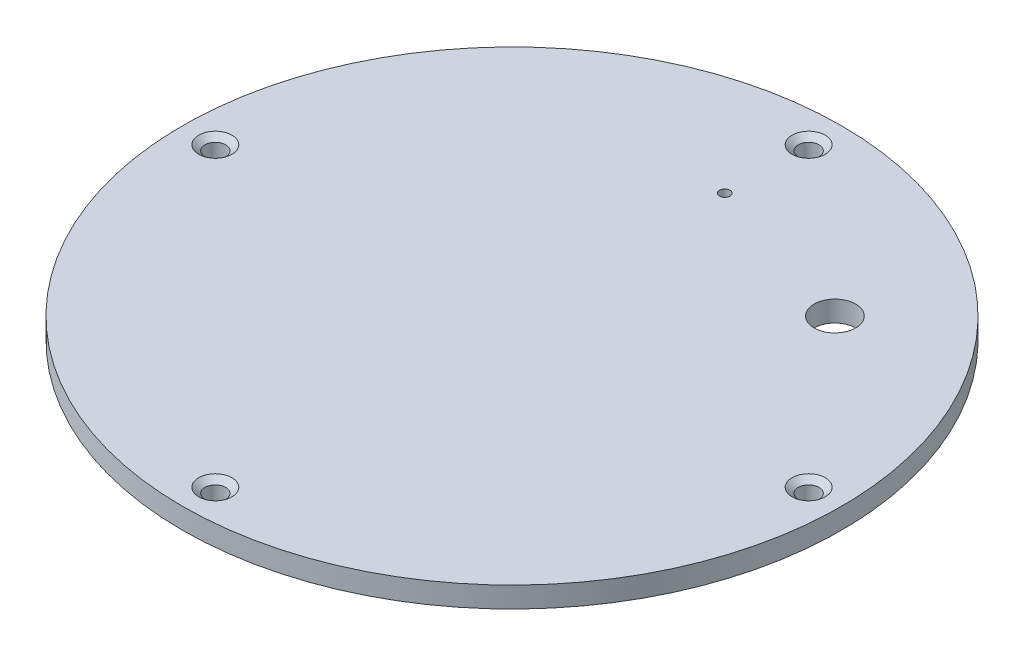
ISO-10303-21;
HEADER;
FILE_DESCRIPTION(('STEP AP214'),'2;1');
FILE_NAME('part.step','',(''),(''),'','','');
FILE_SCHEMA(('AUTOMOTIVE_DESIGN { 1 0 10303 214 1 1 1 1 }'));
ENDSEC;
DATA;
#1=APPLICATION_CONTEXT('core data for automotive mechanical design processes');
#2=APPLICATION_PROTOCOL_DEFINITION('international standard','automotive_design',2000,#1);
#3=PRODUCT_CONTEXT('',#1,'mechanical');
#4=PRODUCT('Part','Part','',(#3));
#5=PRODUCT_RELATED_PRODUCT_CATEGORY('part','',(#4));
#6=PRODUCT_DEFINITION_FORMATION('','',#4);
#7=PRODUCT_DEFINITION_CONTEXT('part definition',#1,'design');
#8=PRODUCT_DEFINITION('design','',#6,#7);
#9=PRODUCT_DEFINITION_SHAPE('','',#8);
#10=(LENGTH_UNIT() NAMED_UNIT(*) SI_UNIT(.MILLI.,.METRE.));
#11=(NAMED_UNIT(*) PLANE_ANGLE_UNIT() SI_UNIT($,.RADIAN.));
#12=(NAMED_UNIT(*) SI_UNIT($,.STERADIAN.) SOLID_ANGLE_UNIT());
#13=UNCERTAINTY_MEASURE_WITH_UNIT(LENGTH_MEASURE(1.E-05),#10,'distance_accuracy_value','');
#14=(GEOMETRIC_REPRESENTATION_CONTEXT(3) GLOBAL_UNCERTAINTY_ASSIGNED_CONTEXT((#13)) GLOBAL_UNIT_ASSIGNED_CONTEXT((#10,
#11,#12)) REPRESENTATION_CONTEXT('',''));
#15=CARTESIAN_POINT('',(0.,0.,0.));
#16=DIRECTION('',(0.,0.,1.));
#17=DIRECTION('',(1.,0.,0.));
#18=AXIS2_PLACEMENT_3D('',#15,#16,#17);
#19=CARTESIAN_POINT('',(0.,1.,0.));
#20=DIRECTION('',(0.,-1.,0.));
#21=DIRECTION('',(0.,0.,-1.));
#22=AXIS2_PLACEMENT_3D('',#19,#20,#21);
#23=CYLINDRICAL_SURFACE('',#22,15.875);
#24=CARTESIAN_POINT('',(0.,1.,0.));
#25=DIRECTION('',(0.,1.,0.));
#26=DIRECTION('',(0.,0.,1.));
#27=AXIS2_PLACEMENT_3D('',#24,#25,#26);
#28=CIRCLE('',#27,15.875);
#29=CARTESIAN_POINT('',(0.,1.,15.875));
#30=VERTEX_POINT('',#29);
#31=EDGE_CURVE('E10',#30,#30,#28,.T.);
#32=ORIENTED_EDGE('',*,*,#31,.F.);
#33=EDGE_LOOP('',(#32));
#34=FACE_BOUND('',#33,.T.);
#35=CARTESIAN_POINT('',(0.,0.,0.));
#36=DIRECTION('',(0.,1.,0.));
#37=DIRECTION('',(0.,0.,1.));
#38=AXIS2_PLACEMENT_3D('',#35,#36,#37);
#39=CIRCLE('',#38,15.875);
#40=CARTESIAN_POINT('',(0.,0.,15.875));
#41=VERTEX_POINT('',#40);
#42=EDGE_CURVE('E35',#41,#41,#39,.T.);
#43=ORIENTED_EDGE('',*,*,#42,.T.);
#44=EDGE_LOOP('',(#43));
#45=FACE_BOUND('',#44,.T.);
#46=ADVANCED_FACE('F32',(#34,#45),#23,.T.);
#47=CARTESIAN_POINT('',(0.,1.,0.));
#48=DIRECTION('',(0.,1.,0.));
#49=DIRECTION('',(0.,0.,1.));
#50=AXIS2_PLACEMENT_3D('',#47,#48,#49);
#51=PLANE('',#50);
#52=CARTESIAN_POINT('',(0.,1.,-10.25));
#53=DIRECTION('',(0.,1.,0.));
#54=DIRECTION('',(0.,0.,1.));
#55=AXIS2_PLACEMENT_3D('',#52,#53,#54);
#56=CIRCLE('',#55,0.25);
#57=CARTESIAN_POINT('',(0.,1.,-10.));
#58=VERTEX_POINT('',#57);
#59=EDGE_CURVE('E79',#58,#58,#56,.T.);
#60=ORIENTED_EDGE('',*,*,#59,.F.);
#61=EDGE_LOOP('',(#60));
#62=FACE_BOUND('',#61,.T.);
#63=CARTESIAN_POINT('',(7.77817459305201,1.,-7.77817459305204));
#64=DIRECTION('',(0.,1.,0.));
#65=DIRECTION('',(0.,0.,1.));
#66=AXIS2_PLACEMENT_3D('',#63,#64,#65);
#67=CIRCLE('',#66,1.00000000000001);
#68=CARTESIAN_POINT('',(7.77817459305201,1.,-6.77817459305202));
#69=VERTEX_POINT('',#68);
#70=EDGE_CURVE('E82',#69,#69,#67,.T.);
#71=ORIENTED_EDGE('',*,*,#70,.F.);
#72=EDGE_LOOP('',(#71));
#73=FACE_BOUND('',#72,.T.);
#74=CARTESIAN_POINT('',(0.,1.,-14.29));
#75=DIRECTION('',(0.,1.,0.));
#76=DIRECTION('',(0.,0.,1.));
#77=AXIS2_PLACEMENT_3D('',#74,#75,#76);
#78=CIRCLE('',#77,0.8);
#79=CARTESIAN_POINT('',(0.,1.,-13.49));
#80=VERTEX_POINT('',#79);
#81=EDGE_CURVE('E76',#80,#80,#78,.T.);
#82=ORIENTED_EDGE('',*,*,#81,.F.);
#83=EDGE_LOOP('',(#82));
#84=FACE_BOUND('',#83,.T.);
#85=CARTESIAN_POINT('',(14.29,1.,0.));
#86=DIRECTION('',(0.,1.,0.));
#87=DIRECTION('',(0.,0.,1.));
#88=AXIS2_PLACEMENT_3D('',#85,#86,#87);
#89=CIRCLE('',#88,0.8);
#90=CARTESIAN_POINT('',(14.29,1.,0.8));
#91=VERTEX_POINT('',#90);
#92=EDGE_CURVE('E67',#91,#91,#89,.T.);
#93=ORIENTED_EDGE('',*,*,#92,.F.);
#94=EDGE_LOOP('',(#93));
#95=FACE_BOUND('',#94,.T.);
#96=CARTESIAN_POINT('',(0.,1.,14.29));
#97=DIRECTION('',(0.,1.,0.));
#98=DIRECTION('',(0.,0.,1.));
#99=AXIS2_PLACEMENT_3D('',#96,#97,#98);
#100=CIRCLE('',#99,0.8);
#101=CARTESIAN_POINT('',(0.,1.,15.09));
#102=VERTEX_POINT('',#101);
#103=EDGE_CURVE('E58',#102,#102,#100,.T.);
#104=ORIENTED_EDGE('',*,*,#103,.F.);
#105=EDGE_LOOP('',(#104));
#106=FACE_BOUND('',#105,.T.);
#107=CARTESIAN_POINT('',(-14.29,1.,0.));
#108=DIRECTION('',(0.,1.,0.));
#109=DIRECTION('',(0.,0.,1.));
#110=AXIS2_PLACEMENT_3D('',#107,#108,#109);
#111=CIRCLE('',#110,0.8);
#112=CARTESIAN_POINT('',(-14.29,1.,0.8));
#113=VERTEX_POINT('',#112);
#114=EDGE_CURVE('E49',#113,#113,#111,.T.);
#115=ORIENTED_EDGE('',*,*,#114,.F.);
#116=EDGE_LOOP('',(#115));
#117=FACE_BOUND('',#116,.T.);
#118=ORIENTED_EDGE('',*,*,#31,.T.);
#119=EDGE_LOOP('',(#118));
#120=FACE_BOUND('',#119,.T.);
#121=ADVANCED_FACE('F107',(#62,#73,#84,#95,#106,#117,#120),#51,.T.);
#122=CARTESIAN_POINT('',(0.,0.,0.));
#123=DIRECTION('',(0.,1.,0.));
#124=DIRECTION('',(0.,0.,1.));
#125=AXIS2_PLACEMENT_3D('',#122,#123,#124);
#126=PLANE('',#125);
#127=CARTESIAN_POINT('',(0.,0.,-10.25));
#128=DIRECTION('',(0.,1.,0.));
#129=DIRECTION('',(0.,0.,1.));
#130=AXIS2_PLACEMENT_3D('',#127,#128,#129);
#131=CIRCLE('',#130,0.25);
#132=CARTESIAN_POINT('',(0.,0.,-10.));
#133=VERTEX_POINT('',#132);
#134=EDGE_CURVE('E85',#133,#133,#131,.T.);
#135=ORIENTED_EDGE('',*,*,#134,.T.);
#136=EDGE_LOOP('',(#135));
#137=FACE_BOUND('',#136,.T.);
#138=CARTESIAN_POINT('',(7.77817459305201,0.,-7.77817459305204));
#139=DIRECTION('',(0.,1.,0.));
#140=DIRECTION('',(0.,0.,1.));
#141=AXIS2_PLACEMENT_3D('',#138,#139,#140);
#142=CIRCLE('',#141,1.00000000000001);
#143=CARTESIAN_POINT('',(7.77817459305201,0.,-6.77817459305202));
#144=VERTEX_POINT('',#143);
#145=EDGE_CURVE('E86',#144,#144,#142,.T.);
#146=ORIENTED_EDGE('',*,*,#145,.T.);
#147=EDGE_LOOP('',(#146));
#148=FACE_BOUND('',#147,.T.);
#149=CARTESIAN_POINT('',(0.,0.,-14.29));
#150=DIRECTION('',(0.,1.,0.));
#151=DIRECTION('',(0.,0.,1.));
#152=AXIS2_PLACEMENT_3D('',#149,#150,#151);
#153=CIRCLE('',#152,0.499999999999988);
#154=CARTESIAN_POINT('',(0.,0.,-13.79));
#155=VERTEX_POINT('',#154);
#156=EDGE_CURVE('E70',#155,#155,#153,.T.);
#157=ORIENTED_EDGE('',*,*,#156,.T.);
#158=EDGE_LOOP('',(#157));
#159=FACE_BOUND('',#158,.T.);
#160=CARTESIAN_POINT('',(14.29,0.,0.));
#161=DIRECTION('',(0.,1.,0.));
#162=DIRECTION('',(0.,0.,1.));
#163=AXIS2_PLACEMENT_3D('',#160,#161,#162);
#164=CIRCLE('',#163,0.499999999999988);
#165=CARTESIAN_POINT('',(14.29,0.,0.499999999999988));
#166=VERTEX_POINT('',#165);
#167=EDGE_CURVE('E61',#166,#166,#164,.T.);
#168=ORIENTED_EDGE('',*,*,#167,.T.);
#169=EDGE_LOOP('',(#168));
#170=FACE_BOUND('',#169,.T.);
#171=CARTESIAN_POINT('',(0.,0.,14.29));
#172=DIRECTION('',(0.,1.,0.));
#173=DIRECTION('',(0.,0.,1.));
#174=AXIS2_PLACEMENT_3D('',#171,#172,#173);
#175=CIRCLE('',#174,0.499999999999988);
#176=CARTESIAN_POINT('',(0.,0.,14.79));
#177=VERTEX_POINT('',#176);
#178=EDGE_CURVE('E52',#177,#177,#175,.T.);
#179=ORIENTED_EDGE('',*,*,#178,.T.);
#180=EDGE_LOOP('',(#179));
#181=FACE_BOUND('',#180,.T.);
#182=CARTESIAN_POINT('',(-14.29,0.,0.));
#183=DIRECTION('',(0.,1.,0.));
#184=DIRECTION('',(0.,0.,1.));
#185=AXIS2_PLACEMENT_3D('',#182,#183,#184);
#186=CIRCLE('',#185,0.499999999999988);
#187=CARTESIAN_POINT('',(-14.29,0.,0.499999999999988));
#188=VERTEX_POINT('',#187);
#189=EDGE_CURVE('E42',#188,#188,#186,.T.);
#190=ORIENTED_EDGE('',*,*,#189,.T.);
#191=EDGE_LOOP('',(#190));
#192=FACE_BOUND('',#191,.T.);
#193=ORIENTED_EDGE('',*,*,#42,.F.);
#194=EDGE_LOOP('',(#193));
#195=FACE_BOUND('',#194,.T.);
#196=ADVANCED_FACE('F92',(#137,#148,#159,#170,#181,#192,#195),#126,.F.);
#197=CARTESIAN_POINT('',(-14.29,1.,0.));
#198=DIRECTION('',(0.,1.,0.));
#199=DIRECTION('',(0.,0.,1.));
#200=AXIS2_PLACEMENT_3D('',#197,#198,#199);
#201=CYLINDRICAL_SURFACE('',#200,0.499999999999994);
#202=ORIENTED_EDGE('',*,*,#189,.F.);
#203=EDGE_LOOP('',(#202));
#204=FACE_BOUND('',#203,.T.);
#205=CARTESIAN_POINT('',(-14.29,0.748270110646816,0.));
#206=DIRECTION('',(0.,1.,0.));
#207=DIRECTION('',(0.,0.,1.));
#208=AXIS2_PLACEMENT_3D('',#205,#206,#207);
#209=CIRCLE('',#208,0.5);
#210=CARTESIAN_POINT('',(-14.29,0.748270110646816,0.5));
#211=VERTEX_POINT('',#210);
#212=EDGE_CURVE('E46',#211,#211,#209,.T.);
#213=ORIENTED_EDGE('',*,*,#212,.T.);
#214=EDGE_LOOP('',(#213));
#215=FACE_BOUND('',#214,.T.);
#216=ADVANCED_FACE('F118',(#204,#215),#201,.F.);
#217=CARTESIAN_POINT('',(-14.29,1.,0.));
#218=DIRECTION('',(0.,1.,0.));
#219=DIRECTION('',(0.,0.,1.));
#220=AXIS2_PLACEMENT_3D('',#217,#218,#219);
#221=CONICAL_SURFACE('',#220,0.8,0.872664625997164);
#222=ORIENTED_EDGE('',*,*,#212,.F.);
#223=EDGE_LOOP('',(#222));
#224=FACE_BOUND('',#223,.T.);
#225=ORIENTED_EDGE('',*,*,#114,.T.);
#226=EDGE_LOOP('',(#225));
#227=FACE_BOUND('',#226,.T.);
#228=ADVANCED_FACE('F122',(#224,#227),#221,.F.);
#229=CARTESIAN_POINT('',(0.,1.,14.29));
#230=DIRECTION('',(0.,1.,0.));
#231=DIRECTION('',(0.,0.,1.));
#232=AXIS2_PLACEMENT_3D('',#229,#230,#231);
#233=CYLINDRICAL_SURFACE('',#232,0.499999999999994);
#234=ORIENTED_EDGE('',*,*,#178,.F.);
#235=EDGE_LOOP('',(#234));
#236=FACE_BOUND('',#235,.T.);
#237=CARTESIAN_POINT('',(0.,0.748270110646816,14.29));
#238=DIRECTION('',(0.,1.,0.));
#239=DIRECTION('',(0.,0.,1.));
#240=AXIS2_PLACEMENT_3D('',#237,#238,#239);
#241=CIRCLE('',#240,0.5);
#242=CARTESIAN_POINT('',(0.,0.748270110646816,14.79));
#243=VERTEX_POINT('',#242);
#244=EDGE_CURVE('E55',#243,#243,#241,.T.);
#245=ORIENTED_EDGE('',*,*,#244,.T.);
#246=EDGE_LOOP('',(#245));
#247=FACE_BOUND('',#246,.T.);
#248=ADVANCED_FACE('F128',(#236,#247),#233,.F.);
#249=CARTESIAN_POINT('',(0.,1.,14.29));
#250=DIRECTION('',(0.,1.,0.));
#251=DIRECTION('',(0.,0.,1.));
#252=AXIS2_PLACEMENT_3D('',#249,#250,#251);
#253=CONICAL_SURFACE('',#252,0.8,0.872664625997164);
#254=ORIENTED_EDGE('',*,*,#244,.F.);
#255=EDGE_LOOP('',(#254));
#256=FACE_BOUND('',#255,.T.);
#257=ORIENTED_EDGE('',*,*,#103,.T.);
#258=EDGE_LOOP('',(#257));
#259=FACE_BOUND('',#258,.T.);
#260=ADVANCED_FACE('F132',(#256,#259),#253,.F.);
#261=CARTESIAN_POINT('',(14.29,1.,0.));
#262=DIRECTION('',(0.,1.,0.));
#263=DIRECTION('',(0.,0.,1.));
#264=AXIS2_PLACEMENT_3D('',#261,#262,#263);
#265=CYLINDRICAL_SURFACE('',#264,0.499999999999994);
#266=ORIENTED_EDGE('',*,*,#167,.F.);
#267=EDGE_LOOP('',(#266));
#268=FACE_BOUND('',#267,.T.);
#269=CARTESIAN_POINT('',(14.29,0.748270110646816,0.));
#270=DIRECTION('',(0.,1.,0.));
#271=DIRECTION('',(0.,0.,1.));
#272=AXIS2_PLACEMENT_3D('',#269,#270,#271);
#273=CIRCLE('',#272,0.5);
#274=CARTESIAN_POINT('',(14.29,0.748270110646816,0.5));
#275=VERTEX_POINT('',#274);
#276=EDGE_CURVE('E64',#275,#275,#273,.T.);
#277=ORIENTED_EDGE('',*,*,#276,.T.);
#278=EDGE_LOOP('',(#277));
#279=FACE_BOUND('',#278,.T.);
#280=ADVANCED_FACE('F136',(#268,#279),#265,.F.);
#281=CARTESIAN_POINT('',(14.29,1.,0.));
#282=DIRECTION('',(0.,1.,0.));
#283=DIRECTION('',(0.,0.,1.));
#284=AXIS2_PLACEMENT_3D('',#281,#282,#283);
#285=CONICAL_SURFACE('',#284,0.8,0.872664625997164);
#286=ORIENTED_EDGE('',*,*,#276,.F.);
#287=EDGE_LOOP('',(#286));
#288=FACE_BOUND('',#287,.T.);
#289=ORIENTED_EDGE('',*,*,#92,.T.);
#290=EDGE_LOOP('',(#289));
#291=FACE_BOUND('',#290,.T.);
#292=ADVANCED_FACE('F140',(#288,#291),#285,.F.);
#293=CARTESIAN_POINT('',(0.,1.,-14.29));
#294=DIRECTION('',(0.,1.,0.));
#295=DIRECTION('',(0.,0.,1.));
#296=AXIS2_PLACEMENT_3D('',#293,#294,#295);
#297=CYLINDRICAL_SURFACE('',#296,0.499999999999994);
#298=ORIENTED_EDGE('',*,*,#156,.F.);
#299=EDGE_LOOP('',(#298));
#300=FACE_BOUND('',#299,.T.);
#301=CARTESIAN_POINT('',(0.,0.748270110646816,-14.29));
#302=DIRECTION('',(0.,1.,0.));
#303=DIRECTION('',(0.,0.,1.));
#304=AXIS2_PLACEMENT_3D('',#301,#302,#303);
#305=CIRCLE('',#304,0.5);
#306=CARTESIAN_POINT('',(0.,0.748270110646816,-13.79));
#307=VERTEX_POINT('',#306);
#308=EDGE_CURVE('E73',#307,#307,#305,.T.);
#309=ORIENTED_EDGE('',*,*,#308,.T.);
#310=EDGE_LOOP('',(#309));
#311=FACE_BOUND('',#310,.T.);
#312=ADVANCED_FACE('F144',(#300,#311),#297,.F.);
#313=CARTESIAN_POINT('',(0.,1.,-14.29));
#314=DIRECTION('',(0.,1.,0.));
#315=DIRECTION('',(0.,0.,1.));
#316=AXIS2_PLACEMENT_3D('',#313,#314,#315);
#317=CONICAL_SURFACE('',#316,0.8,0.872664625997164);
#318=ORIENTED_EDGE('',*,*,#308,.F.);
#319=EDGE_LOOP('',(#318));
#320=FACE_BOUND('',#319,.T.);
#321=ORIENTED_EDGE('',*,*,#81,.T.);
#322=EDGE_LOOP('',(#321));
#323=FACE_BOUND('',#322,.T.);
#324=ADVANCED_FACE('F103',(#320,#323),#317,.F.);
#325=CARTESIAN_POINT('',(7.77817459305201,0.,-7.77817459305204));
#326=DIRECTION('',(0.,1.,0.));
#327=DIRECTION('',(0.,0.,1.));
#328=AXIS2_PLACEMENT_3D('',#325,#326,#327);
#329=CYLINDRICAL_SURFACE('',#328,1.00000000000001);
#330=ORIENTED_EDGE('',*,*,#70,.T.);
#331=EDGE_LOOP('',(#330));
#332=FACE_BOUND('',#331,.T.);
#333=ORIENTED_EDGE('',*,*,#145,.F.);
#334=EDGE_LOOP('',(#333));
#335=FACE_BOUND('',#334,.T.);
#336=ADVANCED_FACE('F97',(#332,#335),#329,.F.);
#337=CARTESIAN_POINT('',(0.,0.,-10.25));
#338=DIRECTION('',(0.,1.,0.));
#339=DIRECTION('',(0.,0.,1.));
#340=AXIS2_PLACEMENT_3D('',#337,#338,#339);
#341=CYLINDRICAL_SURFACE('',#340,0.25);
#342=ORIENTED_EDGE('',*,*,#59,.T.);
#343=EDGE_LOOP('',(#342));
#344=FACE_BOUND('',#343,.T.);
#345=ORIENTED_EDGE('',*,*,#134,.F.);
#346=EDGE_LOOP('',(#345));
#347=FACE_BOUND('',#346,.T.);
#348=ADVANCED_FACE('F95',(#344,#347),#341,.F.);
#349=CLOSED_SHELL('',(#46,#121,#196,#216,#228,#248,#260,#280,#292,#312,#324,#336,#348));
#350=MANIFOLD_SOLID_BREP('B2',#349);
#351=ADVANCED_BREP_SHAPE_REPRESENTATION('',(#18,#350),#14);
#352=SHAPE_DEFINITION_REPRESENTATION(#9,#351);
ENDSEC;
END-ISO-10303-21;
